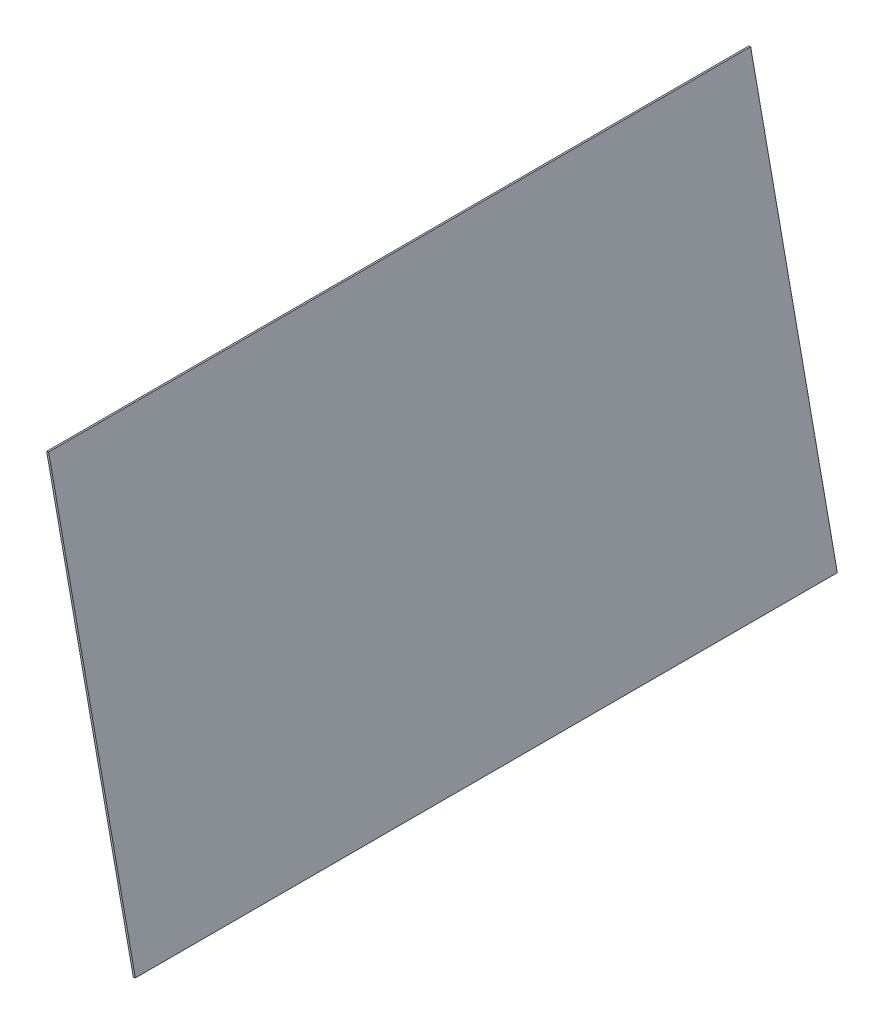
ISO-10303-21;
HEADER;
FILE_DESCRIPTION(('STEP AP214'),'2;1');
FILE_NAME('part.step','',(''),(''),'','','');
FILE_SCHEMA(('AUTOMOTIVE_DESIGN { 1 0 10303 214 1 1 1 1 }'));
ENDSEC;
DATA;
#1=APPLICATION_CONTEXT('core data for automotive mechanical design processes');
#2=APPLICATION_PROTOCOL_DEFINITION('international standard','automotive_design',2000,#1);
#3=PRODUCT_CONTEXT('',#1,'mechanical');
#4=PRODUCT('Part','Part','',(#3));
#5=PRODUCT_RELATED_PRODUCT_CATEGORY('part','',(#4));
#6=PRODUCT_DEFINITION_FORMATION('','',#4);
#7=PRODUCT_DEFINITION_CONTEXT('part definition',#1,'design');
#8=PRODUCT_DEFINITION('design','',#6,#7);
#9=PRODUCT_DEFINITION_SHAPE('','',#8);
#10=(LENGTH_UNIT() NAMED_UNIT(*) SI_UNIT(.MILLI.,.METRE.));
#11=(NAMED_UNIT(*) PLANE_ANGLE_UNIT() SI_UNIT($,.RADIAN.));
#12=(NAMED_UNIT(*) SI_UNIT($,.STERADIAN.) SOLID_ANGLE_UNIT());
#13=UNCERTAINTY_MEASURE_WITH_UNIT(LENGTH_MEASURE(1.E-05),#10,'distance_accuracy_value','');
#14=(GEOMETRIC_REPRESENTATION_CONTEXT(3) GLOBAL_UNCERTAINTY_ASSIGNED_CONTEXT((#13)) GLOBAL_UNIT_ASSIGNED_CONTEXT((#10,
#11,#12)) REPRESENTATION_CONTEXT('',''));
#15=CARTESIAN_POINT('',(0.,0.,0.));
#16=DIRECTION('',(0.,0.,1.));
#17=DIRECTION('',(1.,0.,0.));
#18=AXIS2_PLACEMENT_3D('',#15,#16,#17);
#19=CARTESIAN_POINT('',(43.62839930494,6.992136697285,39.56));
#20=DIRECTION('',(0.978598276565702,0.205780011426372,0.));
#21=DIRECTION('',(0.,0.,1.));
#22=AXIS2_PLACEMENT_3D('',#19,#20,#21);
#23=PLANE('',#22);
#24=DIRECTION('',(0.,0.,-1.));
#25=VECTOR('',#24,1.);
#26=CARTESIAN_POINT('',(43.6530938940894,6.87470020663744,43.2));
#27=LINE('',#26,#25);
#28=CARTESIAN_POINT('',(43.6530938940932,6.87470020663761,46.7));
#29=VERTEX_POINT('',#28);
#30=CARTESIAN_POINT('',(43.6530938940919,6.87470020663759,39.7));
#31=VERTEX_POINT('',#30);
#32=EDGE_CURVE('E21',#29,#31,#27,.T.);
#33=ORIENTED_EDGE('',*,*,#32,.F.);
#34=DIRECTION('',(-0.20578001142641,0.978598276565694,0.));
#35=VECTOR('',#34,1.);
#36=CARTESIAN_POINT('',(44.0852319180893,4.81964382585042,46.7));
#37=LINE('',#36,#35);
#38=CARTESIAN_POINT('',(44.5173699420861,2.76458744506257,46.7));
#39=VERTEX_POINT('',#38);
#40=EDGE_CURVE('E59',#39,#29,#37,.T.);
#41=ORIENTED_EDGE('',*,*,#40,.F.);
#42=DIRECTION('',(0.,0.,1.));
#43=VECTOR('',#42,1.);
#44=CARTESIAN_POINT('',(44.5173699420892,2.76458744506244,43.2));
#45=LINE('',#44,#43);
#46=CARTESIAN_POINT('',(44.5173699420861,2.76458744506257,39.7));
#47=VERTEX_POINT('',#46);
#48=EDGE_CURVE('E54',#47,#39,#45,.T.);
#49=ORIENTED_EDGE('',*,*,#48,.F.);
#50=DIRECTION('',(0.20578001142641,-0.978598276565694,0.));
#51=VECTOR('',#50,1.);
#52=CARTESIAN_POINT('',(44.0852319180893,4.81964382585042,39.7));
#53=LINE('',#52,#51);
#54=EDGE_CURVE('E69',#31,#47,#53,.T.);
#55=ORIENTED_EDGE('',*,*,#54,.F.);
#56=EDGE_LOOP('',(#33,#41,#49,#55));
#57=FACE_BOUND('',#56,.T.);
#58=ADVANCED_FACE('F17',(#57),#23,.T.);
#59=CARTESIAN_POINT('',(43.63313048925,6.870502294405,39.56));
#60=DIRECTION('',(-0.205780011420343,0.97859827656697,0.));
#61=DIRECTION('',(0.,0.,1.));
#62=AXIS2_PLACEMENT_3D('',#59,#60,#61);
#63=PLANE('',#62);
#64=DIRECTION('',(0.,0.,1.));
#65=VECTOR('',#64,1.);
#66=CARTESIAN_POINT('',(43.633521928555,6.87058460640952,43.2));
#67=LINE('',#66,#65);
#68=CARTESIAN_POINT('',(43.633521928558,6.87058460640944,39.7));
#69=VERTEX_POINT('',#68);
#70=CARTESIAN_POINT('',(43.633521928558,6.87058460640944,46.7));
#71=VERTEX_POINT('',#70);
#72=EDGE_CURVE('E75',#69,#71,#67,.T.);
#73=ORIENTED_EDGE('',*,*,#72,.T.);
#74=DIRECTION('',(-0.978598276577051,-0.205780011372404,0.));
#75=VECTOR('',#74,1.);
#76=CARTESIAN_POINT('',(43.6433079113249,6.87264240652352,46.7));
#77=LINE('',#76,#75);
#78=EDGE_CURVE('E64',#29,#71,#77,.T.);
#79=ORIENTED_EDGE('',*,*,#78,.F.);
#80=ORIENTED_EDGE('',*,*,#32,.T.);
#81=DIRECTION('',(0.978598276577051,0.205780011372404,0.));
#82=VECTOR('',#81,1.);
#83=CARTESIAN_POINT('',(43.6433079113249,6.87264240652352,39.7));
#84=LINE('',#83,#82);
#85=EDGE_CURVE('E80',#69,#31,#84,.T.);
#86=ORIENTED_EDGE('',*,*,#85,.F.);
#87=EDGE_LOOP('',(#73,#79,#80,#86));
#88=FACE_BOUND('',#87,.T.);
#89=ADVANCED_FACE('F74',(#88),#63,.T.);
#90=CARTESIAN_POINT('',(43.60843590009,6.987938785052,46.7));
#91=DIRECTION('',(0.,0.,1.));
#92=DIRECTION('',(0.205780011428524,-0.978598276565249,0.));
#93=AXIS2_PLACEMENT_3D('',#90,#91,#92);
#94=PLANE('',#93);
#95=ORIENTED_EDGE('',*,*,#40,.T.);
#96=ORIENTED_EDGE('',*,*,#78,.T.);
#97=DIRECTION('',(0.205780011428526,-0.978598276565249,0.));
#98=VECTOR('',#97,1.);
#99=CARTESIAN_POINT('',(44.065659952555,4.815528225622,46.7));
#100=LINE('',#99,#98);
#101=CARTESIAN_POINT('',(44.4977979765542,2.76047184483429,46.7));
#102=VERTEX_POINT('',#101);
#103=EDGE_CURVE('E85',#71,#102,#100,.T.);
#104=ORIENTED_EDGE('',*,*,#103,.T.);
#105=DIRECTION('',(-0.978598276587275,-0.205780011323779,0.));
#106=VECTOR('',#105,1.);
#107=CARTESIAN_POINT('',(44.50758395932,2.7625296449485,46.7));
#108=LINE('',#107,#106);
#109=EDGE_CURVE('E66',#39,#102,#108,.T.);
#110=ORIENTED_EDGE('',*,*,#109,.F.);
#111=EDGE_LOOP('',(#95,#96,#104,#110));
#112=FACE_BOUND('',#111,.T.);
#113=ADVANCED_FACE('F61',(#112),#94,.T.);
#114=CARTESIAN_POINT('',(44.49740653724,2.76038953283,46.84));
#115=DIRECTION('',(0.205780011323712,-0.978598276587289,0.));
#116=DIRECTION('',(0.,0.,-1.));
#117=AXIS2_PLACEMENT_3D('',#114,#115,#116);
#118=PLANE('',#117);
#119=ORIENTED_EDGE('',*,*,#48,.T.);
#120=ORIENTED_EDGE('',*,*,#109,.T.);
#121=DIRECTION('',(0.,0.,-1.));
#122=VECTOR('',#121,1.);
#123=CARTESIAN_POINT('',(44.497797976555,2.76047184483448,43.2));
#124=LINE('',#123,#122);
#125=CARTESIAN_POINT('',(44.497797976553,2.76047184483441,39.7));
#126=VERTEX_POINT('',#125);
#127=EDGE_CURVE('E27',#102,#126,#124,.T.);
#128=ORIENTED_EDGE('',*,*,#127,.T.);
#129=DIRECTION('',(-0.978598276557802,-0.205780011463941,0.));
#130=VECTOR('',#129,1.);
#131=CARTESIAN_POINT('',(44.5075839593201,2.76252964494848,39.7));
#132=LINE('',#131,#130);
#133=EDGE_CURVE('E35',#47,#126,#132,.T.);
#134=ORIENTED_EDGE('',*,*,#133,.F.);
#135=EDGE_LOOP('',(#119,#120,#128,#134));
#136=FACE_BOUND('',#135,.T.);
#137=ADVANCED_FACE('F89',(#136),#118,.T.);
#138=CARTESIAN_POINT('',(44.5221011264,2.642953042182,39.7));
#139=DIRECTION('',(0.,0.,-1.));
#140=DIRECTION('',(-0.205780011428524,0.978598276565249,0.));
#141=AXIS2_PLACEMENT_3D('',#138,#139,#140);
#142=PLANE('',#141);
#143=ORIENTED_EDGE('',*,*,#54,.T.);
#144=ORIENTED_EDGE('',*,*,#133,.T.);
#145=DIRECTION('',(-0.205780011428524,0.978598276565249,0.));
#146=VECTOR('',#145,1.);
#147=CARTESIAN_POINT('',(44.065659952555,4.815528225622,39.7));
#148=LINE('',#147,#146);
#149=EDGE_CURVE('E11',#126,#69,#148,.T.);
#150=ORIENTED_EDGE('',*,*,#149,.T.);
#151=ORIENTED_EDGE('',*,*,#85,.T.);
#152=EDGE_LOOP('',(#143,#144,#150,#151));
#153=FACE_BOUND('',#152,.T.);
#154=ADVANCED_FACE('F91',(#153),#142,.T.);
#155=CARTESIAN_POINT('',(43.6088273394,6.988021097057,39.56));
#156=DIRECTION('',(0.978598276565249,0.205780011428526,0.));
#157=DIRECTION('',(0.,0.,1.));
#158=AXIS2_PLACEMENT_3D('',#155,#156,#157);
#159=PLANE('',#158);
#160=ORIENTED_EDGE('',*,*,#127,.F.);
#161=ORIENTED_EDGE('',*,*,#103,.F.);
#162=ORIENTED_EDGE('',*,*,#72,.F.);
#163=ORIENTED_EDGE('',*,*,#149,.F.);
#164=EDGE_LOOP('',(#160,#161,#162,#163));
#165=FACE_BOUND('',#164,.T.);
#166=ADVANCED_FACE('F19',(#165),#159,.F.);
#167=CLOSED_SHELL('',(#58,#89,#113,#137,#154,#166));
#168=MANIFOLD_SOLID_BREP('B1',#167);
#169=ADVANCED_BREP_SHAPE_REPRESENTATION('',(#18,#168),#14);
#170=SHAPE_DEFINITION_REPRESENTATION(#9,#169);
ENDSEC;
END-ISO-10303-21;
